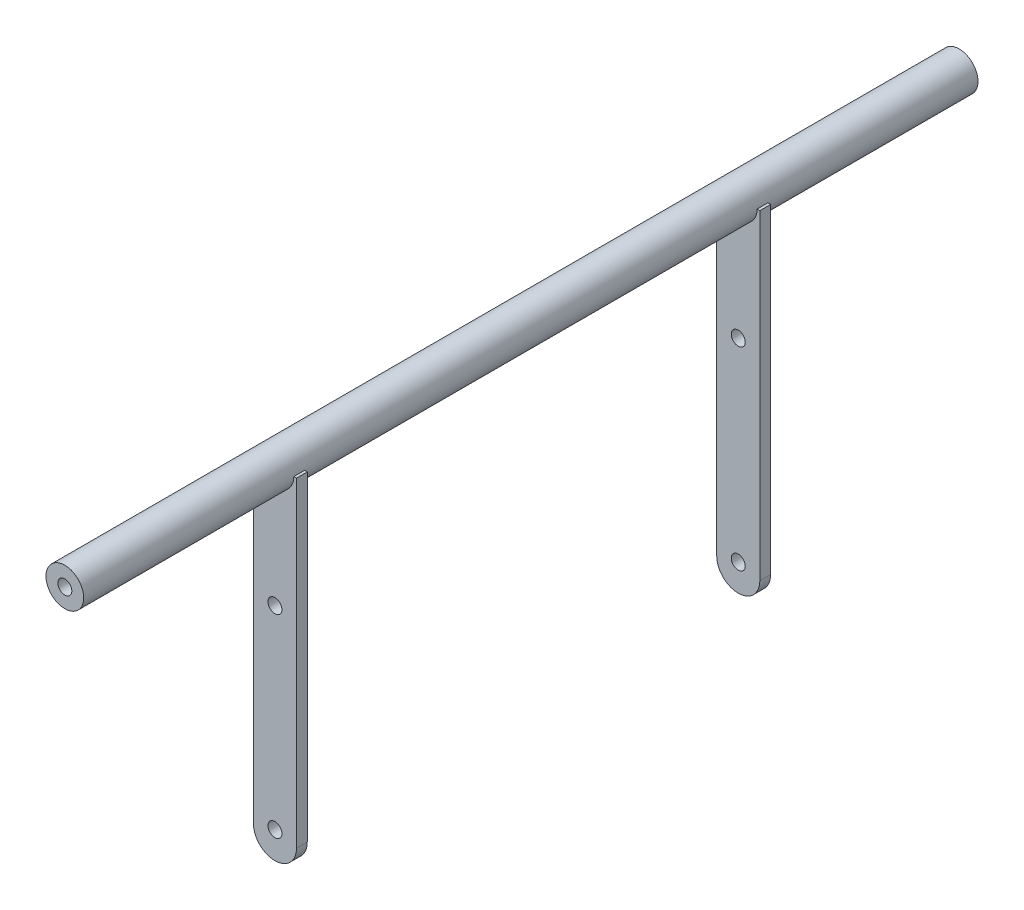
ISO-10303-21;
HEADER;
FILE_DESCRIPTION(('STEP AP214'),'2;1');
FILE_NAME('part.step','',(''),(''),'','','');
FILE_SCHEMA(('AUTOMOTIVE_DESIGN { 1 0 10303 214 1 1 1 1 }'));
ENDSEC;
DATA;
#1=APPLICATION_CONTEXT('core data for automotive mechanical design processes');
#2=APPLICATION_PROTOCOL_DEFINITION('international standard','automotive_design',2000,#1);
#3=PRODUCT_CONTEXT('',#1,'mechanical');
#4=PRODUCT('Part','Part','',(#3));
#5=PRODUCT_RELATED_PRODUCT_CATEGORY('part','',(#4));
#6=PRODUCT_DEFINITION_FORMATION('','',#4);
#7=PRODUCT_DEFINITION_CONTEXT('part definition',#1,'design');
#8=PRODUCT_DEFINITION('design','',#6,#7);
#9=PRODUCT_DEFINITION_SHAPE('','',#8);
#10=(LENGTH_UNIT() NAMED_UNIT(*) SI_UNIT(.MILLI.,.METRE.));
#11=(NAMED_UNIT(*) PLANE_ANGLE_UNIT() SI_UNIT($,.RADIAN.));
#12=(NAMED_UNIT(*) SI_UNIT($,.STERADIAN.) SOLID_ANGLE_UNIT());
#13=UNCERTAINTY_MEASURE_WITH_UNIT(LENGTH_MEASURE(1.E-05),#10,'distance_accuracy_value','');
#14=(GEOMETRIC_REPRESENTATION_CONTEXT(3) GLOBAL_UNCERTAINTY_ASSIGNED_CONTEXT((#13)) GLOBAL_UNIT_ASSIGNED_CONTEXT((#10,
#11,#12)) REPRESENTATION_CONTEXT('',''));
#15=CARTESIAN_POINT('',(0.,0.,0.));
#16=DIRECTION('',(0.,0.,1.));
#17=DIRECTION('',(1.,0.,0.));
#18=AXIS2_PLACEMENT_3D('',#15,#16,#17);
#19=CARTESIAN_POINT('',(0.,0.,415.));
#20=DIRECTION('',(0.,0.,-1.));
#21=DIRECTION('',(-1.,0.,0.));
#22=AXIS2_PLACEMENT_3D('',#19,#20,#21);
#23=CYLINDRICAL_SURFACE('',#22,17.5);
#24=DIRECTION('',(0.,0.,-1.));
#25=VECTOR('',#24,1.);
#26=CARTESIAN_POINT('',(-17.5,0.,415.));
#27=LINE('',#26,#25);
#28=CARTESIAN_POINT('',(-17.5,0.,220.));
#29=VERTEX_POINT('',#28);
#30=CARTESIAN_POINT('',(-17.5,0.,210.));
#31=VERTEX_POINT('',#30);
#32=EDGE_CURVE('E361',#29,#31,#27,.T.);
#33=ORIENTED_EDGE('',*,*,#32,.F.);
#34=CARTESIAN_POINT('',(0.,0.,220.));
#35=DIRECTION('',(0.,0.,-1.));
#36=DIRECTION('',(0.,1.,0.));
#37=AXIS2_PLACEMENT_3D('',#34,#35,#36);
#38=CIRCLE('',#37,17.5);
#39=CARTESIAN_POINT('',(17.5,0.,220.));
#40=VERTEX_POINT('',#39);
#41=EDGE_CURVE('E367',#40,#29,#38,.T.);
#42=ORIENTED_EDGE('',*,*,#41,.F.);
#43=DIRECTION('',(0.,0.,-1.));
#44=VECTOR('',#43,1.);
#45=CARTESIAN_POINT('',(17.5,0.,415.));
#46=LINE('',#45,#44);
#47=CARTESIAN_POINT('',(17.5,0.,210.));
#48=VERTEX_POINT('',#47);
#49=EDGE_CURVE('E357',#48,#40,#46,.F.);
#50=ORIENTED_EDGE('',*,*,#49,.F.);
#51=CARTESIAN_POINT('',(0.,0.,210.));
#52=DIRECTION('',(0.,0.,1.));
#53=DIRECTION('',(0.,-1.,0.));
#54=AXIS2_PLACEMENT_3D('',#51,#52,#53);
#55=CIRCLE('',#54,17.5);
#56=EDGE_CURVE('E364',#31,#48,#55,.T.);
#57=ORIENTED_EDGE('',*,*,#56,.F.);
#58=EDGE_LOOP('',(#33,#42,#50,#57));
#59=FACE_BOUND('',#58,.T.);
#60=CARTESIAN_POINT('',(0.,0.,415.));
#61=DIRECTION('',(0.,0.,1.));
#62=DIRECTION('',(1.,0.,0.));
#63=AXIS2_PLACEMENT_3D('',#60,#61,#62);
#64=CIRCLE('',#63,17.5);
#65=CARTESIAN_POINT('',(17.5,0.,415.));
#66=VERTEX_POINT('',#65);
#67=EDGE_CURVE('E376',#66,#66,#64,.T.);
#68=ORIENTED_EDGE('',*,*,#67,.F.);
#69=EDGE_LOOP('',(#68));
#70=FACE_BOUND('',#69,.T.);
#71=CARTESIAN_POINT('',(0.,0.,-415.));
#72=DIRECTION('',(0.,0.,1.));
#73=DIRECTION('',(1.,0.,0.));
#74=AXIS2_PLACEMENT_3D('',#71,#72,#73);
#75=CIRCLE('',#74,17.5);
#76=CARTESIAN_POINT('',(17.5,0.,-415.));
#77=VERTEX_POINT('',#76);
#78=EDGE_CURVE('E375',#77,#77,#75,.T.);
#79=ORIENTED_EDGE('',*,*,#78,.T.);
#80=EDGE_LOOP('',(#79));
#81=FACE_BOUND('',#80,.T.);
#82=CARTESIAN_POINT('',(0.,0.,-210.));
#83=DIRECTION('',(0.,0.,-1.));
#84=DIRECTION('',(0.,1.,0.));
#85=AXIS2_PLACEMENT_3D('',#82,#83,#84);
#86=CIRCLE('',#85,17.5);
#87=CARTESIAN_POINT('',(17.5,-1.0164568432923E-13,-210.));
#88=VERTEX_POINT('',#87);
#89=CARTESIAN_POINT('',(-17.5,-1.0164568432923E-13,-210.));
#90=VERTEX_POINT('',#89);
#91=EDGE_CURVE('E199',#88,#90,#86,.T.);
#92=ORIENTED_EDGE('',*,*,#91,.F.);
#93=DIRECTION('',(0.,0.,-1.));
#94=VECTOR('',#93,1.);
#95=CARTESIAN_POINT('',(17.5,-1.0164568432923E-13,415.));
#96=LINE('',#95,#94);
#97=CARTESIAN_POINT('',(17.5,0.,-220.));
#98=VERTEX_POINT('',#97);
#99=EDGE_CURVE('E193',#98,#88,#96,.F.);
#100=ORIENTED_EDGE('',*,*,#99,.F.);
#101=CARTESIAN_POINT('',(0.,0.,-220.));
#102=DIRECTION('',(0.,0.,1.));
#103=DIRECTION('',(0.,-1.,0.));
#104=AXIS2_PLACEMENT_3D('',#101,#102,#103);
#105=CIRCLE('',#104,17.5);
#106=CARTESIAN_POINT('',(-17.5,0.,-220.));
#107=VERTEX_POINT('',#106);
#108=EDGE_CURVE('E194',#107,#98,#105,.T.);
#109=ORIENTED_EDGE('',*,*,#108,.F.);
#110=DIRECTION('',(0.,0.,-1.));
#111=VECTOR('',#110,1.);
#112=CARTESIAN_POINT('',(-17.5,-1.0164568432923E-13,415.));
#113=LINE('',#112,#111);
#114=EDGE_CURVE('E338',#90,#107,#113,.T.);
#115=ORIENTED_EDGE('',*,*,#114,.F.);
#116=EDGE_LOOP('',(#92,#100,#109,#115));
#117=FACE_BOUND('',#116,.T.);
#118=ADVANCED_FACE('F45',(#59,#70,#81,#117),#23,.T.);
#119=CARTESIAN_POINT('',(0.,0.,-415.001));
#120=DIRECTION('',(0.,0.,1.));
#121=DIRECTION('',(1.,0.,0.));
#122=AXIS2_PLACEMENT_3D('',#119,#120,#121);
#123=CYLINDRICAL_SURFACE('',#122,6.5);
#124=DIRECTION('',(0.,0.,1.));
#125=VECTOR('',#124,1.);
#126=CARTESIAN_POINT('',(6.5,0.,-415.001));
#127=LINE('',#126,#125);
#128=CARTESIAN_POINT('',(6.5,0.,220.));
#129=VERTEX_POINT('',#128);
#130=CARTESIAN_POINT('',(6.5,0.,210.));
#131=VERTEX_POINT('',#130);
#132=EDGE_CURVE('E390',#129,#131,#127,.F.);
#133=ORIENTED_EDGE('',*,*,#132,.F.);
#134=CARTESIAN_POINT('',(0.,0.,220.));
#135=DIRECTION('',(0.,0.,-1.));
#136=DIRECTION('',(0.,1.,0.));
#137=AXIS2_PLACEMENT_3D('',#134,#135,#136);
#138=CIRCLE('',#137,6.5);
#139=CARTESIAN_POINT('',(-6.5,0.,220.));
#140=VERTEX_POINT('',#139);
#141=EDGE_CURVE('E387',#140,#129,#138,.F.);
#142=ORIENTED_EDGE('',*,*,#141,.F.);
#143=DIRECTION('',(0.,0.,1.));
#144=VECTOR('',#143,1.);
#145=CARTESIAN_POINT('',(-6.5,0.,-415.001));
#146=LINE('',#145,#144);
#147=CARTESIAN_POINT('',(-6.5,0.,210.));
#148=VERTEX_POINT('',#147);
#149=EDGE_CURVE('E379',#148,#140,#146,.T.);
#150=ORIENTED_EDGE('',*,*,#149,.F.);
#151=CARTESIAN_POINT('',(0.,0.,210.));
#152=DIRECTION('',(0.,0.,1.));
#153=DIRECTION('',(0.,-1.,0.));
#154=AXIS2_PLACEMENT_3D('',#151,#152,#153);
#155=CIRCLE('',#154,6.5);
#156=EDGE_CURVE('E384',#131,#148,#155,.F.);
#157=ORIENTED_EDGE('',*,*,#156,.F.);
#158=EDGE_LOOP('',(#133,#142,#150,#157));
#159=FACE_BOUND('',#158,.T.);
#160=CARTESIAN_POINT('',(0.,0.,415.));
#161=DIRECTION('',(0.,0.,1.));
#162=DIRECTION('',(1.,0.,0.));
#163=AXIS2_PLACEMENT_3D('',#160,#161,#162);
#164=CIRCLE('',#163,6.5);
#165=CARTESIAN_POINT('',(6.5,0.,415.));
#166=VERTEX_POINT('',#165);
#167=EDGE_CURVE('E369',#166,#166,#164,.T.);
#168=ORIENTED_EDGE('',*,*,#167,.T.);
#169=EDGE_LOOP('',(#168));
#170=FACE_BOUND('',#169,.T.);
#171=CARTESIAN_POINT('',(0.,0.,-415.));
#172=DIRECTION('',(0.,0.,1.));
#173=DIRECTION('',(1.,0.,0.));
#174=AXIS2_PLACEMENT_3D('',#171,#172,#173);
#175=CIRCLE('',#174,6.5);
#176=CARTESIAN_POINT('',(6.5,0.,-415.));
#177=VERTEX_POINT('',#176);
#178=EDGE_CURVE('E372',#177,#177,#175,.F.);
#179=ORIENTED_EDGE('',*,*,#178,.T.);
#180=EDGE_LOOP('',(#179));
#181=FACE_BOUND('',#180,.T.);
#182=CARTESIAN_POINT('',(0.,0.,-210.));
#183=DIRECTION('',(0.,0.,-1.));
#184=DIRECTION('',(0.,1.,0.));
#185=AXIS2_PLACEMENT_3D('',#182,#183,#184);
#186=CIRCLE('',#185,6.5);
#187=CARTESIAN_POINT('',(-6.5,1.0164592925859E-13,-210.));
#188=VERTEX_POINT('',#187);
#189=CARTESIAN_POINT('',(6.5,1.0164592925859E-13,-210.));
#190=VERTEX_POINT('',#189);
#191=EDGE_CURVE('E402',#188,#190,#186,.F.);
#192=ORIENTED_EDGE('',*,*,#191,.F.);
#193=DIRECTION('',(0.,0.,1.));
#194=VECTOR('',#193,1.);
#195=CARTESIAN_POINT('',(-6.5,1.0164592925859E-13,-415.001));
#196=LINE('',#195,#194);
#197=CARTESIAN_POINT('',(-6.5,0.,-220.));
#198=VERTEX_POINT('',#197);
#199=EDGE_CURVE('E396',#198,#188,#196,.T.);
#200=ORIENTED_EDGE('',*,*,#199,.F.);
#201=CARTESIAN_POINT('',(0.,0.,-220.));
#202=DIRECTION('',(0.,0.,1.));
#203=DIRECTION('',(0.,-1.,0.));
#204=AXIS2_PLACEMENT_3D('',#201,#202,#203);
#205=CIRCLE('',#204,6.5);
#206=CARTESIAN_POINT('',(6.5,0.,-220.));
#207=VERTEX_POINT('',#206);
#208=EDGE_CURVE('E393',#207,#198,#205,.F.);
#209=ORIENTED_EDGE('',*,*,#208,.F.);
#210=DIRECTION('',(0.,0.,1.));
#211=VECTOR('',#210,1.);
#212=CARTESIAN_POINT('',(6.5,1.0164592925859E-13,-415.001));
#213=LINE('',#212,#211);
#214=EDGE_CURVE('E399',#190,#207,#213,.F.);
#215=ORIENTED_EDGE('',*,*,#214,.F.);
#216=EDGE_LOOP('',(#192,#200,#209,#215));
#217=FACE_BOUND('',#216,.T.);
#218=ADVANCED_FACE('F298',(#159,#170,#181,#217),#123,.F.);
#219=CARTESIAN_POINT('',(0.,0.,415.));
#220=DIRECTION('',(0.,0.,1.));
#221=DIRECTION('',(1.,0.,0.));
#222=AXIS2_PLACEMENT_3D('',#219,#220,#221);
#223=PLANE('',#222);
#224=ORIENTED_EDGE('',*,*,#167,.F.);
#225=EDGE_LOOP('',(#224));
#226=FACE_BOUND('',#225,.T.);
#227=ORIENTED_EDGE('',*,*,#67,.T.);
#228=EDGE_LOOP('',(#227));
#229=FACE_BOUND('',#228,.T.);
#230=ADVANCED_FACE('F304',(#226,#229),#223,.T.);
#231=CARTESIAN_POINT('',(0.,0.,-415.));
#232=DIRECTION('',(0.,0.,1.));
#233=DIRECTION('',(1.,0.,0.));
#234=AXIS2_PLACEMENT_3D('',#231,#232,#233);
#235=PLANE('',#234);
#236=ORIENTED_EDGE('',*,*,#178,.F.);
#237=EDGE_LOOP('',(#236));
#238=FACE_BOUND('',#237,.T.);
#239=ORIENTED_EDGE('',*,*,#78,.F.);
#240=EDGE_LOOP('',(#239));
#241=FACE_BOUND('',#240,.T.);
#242=ADVANCED_FACE('F310',(#238,#241),#235,.F.);
#243=CARTESIAN_POINT('',(20.,0.,220.));
#244=DIRECTION('',(0.,-1.,0.));
#245=DIRECTION('',(0.,0.,-1.));
#246=AXIS2_PLACEMENT_3D('',#243,#244,#245);
#247=PLANE('',#246);
#248=DIRECTION('',(-1.,0.,0.));
#249=VECTOR('',#248,1.);
#250=CARTESIAN_POINT('',(20.,0.,220.));
#251=LINE('',#250,#249);
#252=EDGE_CURVE('E353',#129,#140,#251,.T.);
#253=ORIENTED_EDGE('',*,*,#252,.F.);
#254=ORIENTED_EDGE('',*,*,#132,.T.);
#255=DIRECTION('',(-1.,0.,0.));
#256=VECTOR('',#255,1.);
#257=CARTESIAN_POINT('',(20.,0.,210.));
#258=LINE('',#257,#256);
#259=EDGE_CURVE('E358',#131,#148,#258,.T.);
#260=ORIENTED_EDGE('',*,*,#259,.T.);
#261=ORIENTED_EDGE('',*,*,#149,.T.);
#262=EDGE_LOOP('',(#253,#254,#260,#261));
#263=FACE_BOUND('',#262,.T.);
#264=ADVANCED_FACE('F432',(#263),#247,.F.);
#265=CARTESIAN_POINT('',(20.,0.,210.));
#266=DIRECTION('',(0.,0.,1.));
#267=DIRECTION('',(0.,-1.,0.));
#268=AXIS2_PLACEMENT_3D('',#265,#266,#267);
#269=PLANE('',#268);
#270=ORIENTED_EDGE('',*,*,#259,.F.);
#271=ORIENTED_EDGE('',*,*,#156,.T.);
#272=EDGE_LOOP('',(#270,#271));
#273=FACE_BOUND('',#272,.T.);
#274=ADVANCED_FACE('F436',(#273),#269,.F.);
#275=CARTESIAN_POINT('',(20.,0.,220.));
#276=DIRECTION('',(0.,0.,-1.));
#277=DIRECTION('',(0.,1.,0.));
#278=AXIS2_PLACEMENT_3D('',#275,#276,#277);
#279=PLANE('',#278);
#280=ORIENTED_EDGE('',*,*,#252,.T.);
#281=ORIENTED_EDGE('',*,*,#141,.T.);
#282=EDGE_LOOP('',(#280,#281));
#283=FACE_BOUND('',#282,.T.);
#284=ADVANCED_FACE('F438',(#283),#279,.F.);
#285=CARTESIAN_POINT('',(0.,-112.5,220.));
#286=DIRECTION('',(0.,0.,1.));
#287=DIRECTION('',(1.,0.,0.));
#288=AXIS2_PLACEMENT_3D('',#285,#286,#287);
#289=CIRCLE('',#288,6.5);
#290=CARTESIAN_POINT('',(6.50000000000002,-112.5,220.));
#291=VERTEX_POINT('',#290);
#292=EDGE_CURVE('E477',#291,#291,#289,.T.);
#293=ORIENTED_EDGE('',*,*,#292,.F.);
#294=EDGE_LOOP('',(#293));
#295=FACE_BOUND('',#294,.T.);
#296=CARTESIAN_POINT('',(0.,-292.5,220.));
#297=DIRECTION('',(0.,0.,1.));
#298=DIRECTION('',(1.,0.,0.));
#299=AXIS2_PLACEMENT_3D('',#296,#297,#298);
#300=CIRCLE('',#299,6.5);
#301=CARTESIAN_POINT('',(6.5,-292.5,220.));
#302=VERTEX_POINT('',#301);
#303=EDGE_CURVE('E261',#302,#302,#300,.T.);
#304=ORIENTED_EDGE('',*,*,#303,.F.);
#305=EDGE_LOOP('',(#304));
#306=FACE_BOUND('',#305,.T.);
#307=DIRECTION('',(0.,-1.,0.));
#308=VECTOR('',#307,1.);
#309=CARTESIAN_POINT('',(-20.,0.,220.));
#310=LINE('',#309,#308);
#311=CARTESIAN_POINT('',(-20.,0.,220.));
#312=VERTEX_POINT('',#311);
#313=CARTESIAN_POINT('',(-20.,-297.5,220.));
#314=VERTEX_POINT('',#313);
#315=EDGE_CURVE('E331',#312,#314,#310,.T.);
#316=ORIENTED_EDGE('',*,*,#315,.T.);
#317=CARTESIAN_POINT('',(0.,-297.5,220.));
#318=DIRECTION('',(0.,0.,-1.));
#319=DIRECTION('',(0.,1.,0.));
#320=AXIS2_PLACEMENT_3D('',#317,#318,#319);
#321=CIRCLE('',#320,20.);
#322=CARTESIAN_POINT('',(0.,-317.5,220.));
#323=VERTEX_POINT('',#322);
#324=EDGE_CURVE('E54',#314,#323,#321,.F.);
#325=ORIENTED_EDGE('',*,*,#324,.T.);
#326=CARTESIAN_POINT('',(0.,-297.5,220.));
#327=DIRECTION('',(0.,0.,-1.));
#328=DIRECTION('',(0.,1.,0.));
#329=AXIS2_PLACEMENT_3D('',#326,#327,#328);
#330=CIRCLE('',#329,20.);
#331=CARTESIAN_POINT('',(20.,-297.5,220.));
#332=VERTEX_POINT('',#331);
#333=EDGE_CURVE('E62',#323,#332,#330,.F.);
#334=ORIENTED_EDGE('',*,*,#333,.T.);
#335=DIRECTION('',(0.,-1.,0.));
#336=VECTOR('',#335,1.);
#337=CARTESIAN_POINT('',(20.,0.,220.));
#338=LINE('',#337,#336);
#339=CARTESIAN_POINT('',(20.,0.,220.));
#340=VERTEX_POINT('',#339);
#341=EDGE_CURVE('E348',#340,#332,#338,.T.);
#342=ORIENTED_EDGE('',*,*,#341,.F.);
#343=EDGE_CURVE('E349',#340,#40,#251,.T.);
#344=ORIENTED_EDGE('',*,*,#343,.T.);
#345=ORIENTED_EDGE('',*,*,#41,.T.);
#346=EDGE_CURVE('E336',#29,#312,#251,.T.);
#347=ORIENTED_EDGE('',*,*,#346,.T.);
#348=EDGE_LOOP('',(#316,#325,#334,#342,#344,#345,#347));
#349=FACE_BOUND('',#348,.T.);
#350=ADVANCED_FACE('F333',(#295,#306,#349),#279,.F.);
#351=CARTESIAN_POINT('',(0.,-112.5,210.));
#352=DIRECTION('',(0.,0.,1.));
#353=DIRECTION('',(0.,-1.,0.));
#354=AXIS2_PLACEMENT_3D('',#351,#352,#353);
#355=CIRCLE('',#354,6.5);
#356=CARTESIAN_POINT('',(0.,-119.,210.));
#357=VERTEX_POINT('',#356);
#358=EDGE_CURVE('E267',#357,#357,#355,.T.);
#359=ORIENTED_EDGE('',*,*,#358,.T.);
#360=EDGE_LOOP('',(#359));
#361=FACE_BOUND('',#360,.T.);
#362=CARTESIAN_POINT('',(0.,-292.5,210.));
#363=DIRECTION('',(0.,0.,1.));
#364=DIRECTION('',(0.,-1.,0.));
#365=AXIS2_PLACEMENT_3D('',#362,#363,#364);
#366=CIRCLE('',#365,6.5);
#367=CARTESIAN_POINT('',(0.,-299.,210.));
#368=VERTEX_POINT('',#367);
#369=EDGE_CURVE('E257',#368,#368,#366,.T.);
#370=ORIENTED_EDGE('',*,*,#369,.T.);
#371=EDGE_LOOP('',(#370));
#372=FACE_BOUND('',#371,.T.);
#373=CARTESIAN_POINT('',(0.,-297.5,210.));
#374=DIRECTION('',(0.,0.,1.));
#375=DIRECTION('',(0.,-1.,0.));
#376=AXIS2_PLACEMENT_3D('',#373,#374,#375);
#377=CIRCLE('',#376,20.);
#378=CARTESIAN_POINT('',(20.,-297.5,210.));
#379=VERTEX_POINT('',#378);
#380=CARTESIAN_POINT('',(0.,-317.5,210.));
#381=VERTEX_POINT('',#380);
#382=EDGE_CURVE('E245',#379,#381,#377,.F.);
#383=ORIENTED_EDGE('',*,*,#382,.T.);
#384=CARTESIAN_POINT('',(0.,-297.5,210.));
#385=DIRECTION('',(0.,0.,1.));
#386=DIRECTION('',(0.,-1.,0.));
#387=AXIS2_PLACEMENT_3D('',#384,#385,#386);
#388=CIRCLE('',#387,20.);
#389=CARTESIAN_POINT('',(-20.,-297.5,210.));
#390=VERTEX_POINT('',#389);
#391=EDGE_CURVE('E247',#381,#390,#388,.F.);
#392=ORIENTED_EDGE('',*,*,#391,.T.);
#393=DIRECTION('',(0.,1.,0.));
#394=VECTOR('',#393,1.);
#395=CARTESIAN_POINT('',(-20.,0.,210.));
#396=LINE('',#395,#394);
#397=CARTESIAN_POINT('',(-20.,0.,210.));
#398=VERTEX_POINT('',#397);
#399=EDGE_CURVE('E332',#390,#398,#396,.T.);
#400=ORIENTED_EDGE('',*,*,#399,.T.);
#401=EDGE_CURVE('E352',#31,#398,#258,.T.);
#402=ORIENTED_EDGE('',*,*,#401,.F.);
#403=ORIENTED_EDGE('',*,*,#56,.T.);
#404=CARTESIAN_POINT('',(20.,0.,210.));
#405=VERTEX_POINT('',#404);
#406=EDGE_CURVE('E354',#405,#48,#258,.T.);
#407=ORIENTED_EDGE('',*,*,#406,.F.);
#408=DIRECTION('',(0.,1.,0.));
#409=VECTOR('',#408,1.);
#410=CARTESIAN_POINT('',(20.,0.,210.));
#411=LINE('',#410,#409);
#412=EDGE_CURVE('E665',#379,#405,#411,.T.);
#413=ORIENTED_EDGE('',*,*,#412,.F.);
#414=EDGE_LOOP('',(#383,#392,#400,#402,#403,#407,#413));
#415=FACE_BOUND('',#414,.T.);
#416=ADVANCED_FACE('F279',(#361,#372,#415),#269,.F.);
#417=ORIENTED_EDGE('',*,*,#346,.F.);
#418=ORIENTED_EDGE('',*,*,#32,.T.);
#419=ORIENTED_EDGE('',*,*,#401,.T.);
#420=DIRECTION('',(0.,0.,1.));
#421=VECTOR('',#420,1.);
#422=CARTESIAN_POINT('',(-20.,0.,220.));
#423=LINE('',#422,#421);
#424=EDGE_CURVE('E340',#398,#312,#423,.T.);
#425=ORIENTED_EDGE('',*,*,#424,.T.);
#426=EDGE_LOOP('',(#417,#418,#419,#425));
#427=FACE_BOUND('',#426,.T.);
#428=ADVANCED_FACE('F428',(#427),#247,.F.);
#429=ORIENTED_EDGE('',*,*,#406,.T.);
#430=ORIENTED_EDGE('',*,*,#49,.T.);
#431=ORIENTED_EDGE('',*,*,#343,.F.);
#432=DIRECTION('',(0.,0.,1.));
#433=VECTOR('',#432,1.);
#434=CARTESIAN_POINT('',(20.,0.,220.));
#435=LINE('',#434,#433);
#436=EDGE_CURVE('E344',#405,#340,#435,.T.);
#437=ORIENTED_EDGE('',*,*,#436,.F.);
#438=EDGE_LOOP('',(#429,#430,#431,#437));
#439=FACE_BOUND('',#438,.T.);
#440=ADVANCED_FACE('F423',(#439),#247,.F.);
#441=CARTESIAN_POINT('',(20.,0.,0.));
#442=DIRECTION('',(1.,0.,0.));
#443=DIRECTION('',(0.,0.,-1.));
#444=AXIS2_PLACEMENT_3D('',#441,#442,#443);
#445=PLANE('',#444);
#446=ORIENTED_EDGE('',*,*,#341,.T.);
#447=DIRECTION('',(0.,0.,-1.));
#448=VECTOR('',#447,1.);
#449=CARTESIAN_POINT('',(20.,-297.5,210.));
#450=LINE('',#449,#448);
#451=EDGE_CURVE('E13',#332,#379,#450,.T.);
#452=ORIENTED_EDGE('',*,*,#451,.T.);
#453=ORIENTED_EDGE('',*,*,#412,.T.);
#454=ORIENTED_EDGE('',*,*,#436,.T.);
#455=EDGE_LOOP('',(#446,#452,#453,#454));
#456=FACE_BOUND('',#455,.T.);
#457=ADVANCED_FACE('F420',(#456),#445,.T.);
#458=CARTESIAN_POINT('',(-20.,0.,0.));
#459=DIRECTION('',(1.,0.,0.));
#460=DIRECTION('',(0.,0.,-1.));
#461=AXIS2_PLACEMENT_3D('',#458,#459,#460);
#462=PLANE('',#461);
#463=ORIENTED_EDGE('',*,*,#399,.F.);
#464=DIRECTION('',(0.,0.,-1.));
#465=VECTOR('',#464,1.);
#466=CARTESIAN_POINT('',(-20.,-297.5,0.));
#467=LINE('',#466,#465);
#468=EDGE_CURVE('E249',#390,#314,#467,.F.);
#469=ORIENTED_EDGE('',*,*,#468,.T.);
#470=ORIENTED_EDGE('',*,*,#315,.F.);
#471=ORIENTED_EDGE('',*,*,#424,.F.);
#472=EDGE_LOOP('',(#463,#469,#470,#471));
#473=FACE_BOUND('',#472,.T.);
#474=ADVANCED_FACE('F329',(#473),#462,.F.);
#475=CARTESIAN_POINT('',(20.,0.,-220.));
#476=DIRECTION('',(0.,0.,1.));
#477=DIRECTION('',(0.,-1.,0.));
#478=AXIS2_PLACEMENT_3D('',#475,#476,#477);
#479=PLANE('',#478);
#480=DIRECTION('',(-1.,0.,0.));
#481=VECTOR('',#480,1.);
#482=CARTESIAN_POINT('',(20.,0.,-220.));
#483=LINE('',#482,#481);
#484=EDGE_CURVE('E206',#207,#198,#483,.T.);
#485=ORIENTED_EDGE('',*,*,#484,.F.);
#486=ORIENTED_EDGE('',*,*,#208,.T.);
#487=EDGE_LOOP('',(#485,#486));
#488=FACE_BOUND('',#487,.T.);
#489=ADVANCED_FACE('F427',(#488),#479,.F.);
#490=CARTESIAN_POINT('',(20.,0.,-210.));
#491=DIRECTION('',(0.,0.,-1.));
#492=DIRECTION('',(0.,1.,0.));
#493=AXIS2_PLACEMENT_3D('',#490,#491,#492);
#494=PLANE('',#493);
#495=DIRECTION('',(-1.,0.,0.));
#496=VECTOR('',#495,1.);
#497=CARTESIAN_POINT('',(20.,0.,-210.));
#498=LINE('',#497,#496);
#499=EDGE_CURVE('E195',#190,#188,#498,.T.);
#500=ORIENTED_EDGE('',*,*,#499,.T.);
#501=ORIENTED_EDGE('',*,*,#191,.T.);
#502=EDGE_LOOP('',(#500,#501));
#503=FACE_BOUND('',#502,.T.);
#504=ADVANCED_FACE('F415',(#503),#494,.F.);
#505=CARTESIAN_POINT('',(20.,0.,-220.));
#506=DIRECTION('',(0.,-1.,0.));
#507=DIRECTION('',(0.,0.,-1.));
#508=AXIS2_PLACEMENT_3D('',#505,#506,#507);
#509=PLANE('',#508);
#510=ORIENTED_EDGE('',*,*,#499,.F.);
#511=ORIENTED_EDGE('',*,*,#214,.T.);
#512=ORIENTED_EDGE('',*,*,#484,.T.);
#513=ORIENTED_EDGE('',*,*,#199,.T.);
#514=EDGE_LOOP('',(#510,#511,#512,#513));
#515=FACE_BOUND('',#514,.T.);
#516=ADVANCED_FACE('F409',(#515),#509,.F.);
#517=CARTESIAN_POINT('',(-20.,0.,-210.));
#518=VERTEX_POINT('',#517);
#519=EDGE_CURVE('E197',#90,#518,#498,.T.);
#520=ORIENTED_EDGE('',*,*,#519,.F.);
#521=ORIENTED_EDGE('',*,*,#114,.T.);
#522=CARTESIAN_POINT('',(-20.,0.,-220.));
#523=VERTEX_POINT('',#522);
#524=EDGE_CURVE('E207',#107,#523,#483,.T.);
#525=ORIENTED_EDGE('',*,*,#524,.T.);
#526=DIRECTION('',(0.,0.,1.));
#527=VECTOR('',#526,1.);
#528=CARTESIAN_POINT('',(-20.,0.,-220.));
#529=LINE('',#528,#527);
#530=EDGE_CURVE('E218',#523,#518,#529,.T.);
#531=ORIENTED_EDGE('',*,*,#530,.T.);
#532=EDGE_LOOP('',(#520,#521,#525,#531));
#533=FACE_BOUND('',#532,.T.);
#534=ADVANCED_FACE('F407',(#533),#509,.F.);
#535=CARTESIAN_POINT('',(20.,0.,-220.));
#536=VERTEX_POINT('',#535);
#537=EDGE_CURVE('E203',#536,#98,#483,.T.);
#538=ORIENTED_EDGE('',*,*,#537,.T.);
#539=ORIENTED_EDGE('',*,*,#99,.T.);
#540=CARTESIAN_POINT('',(20.,0.,-210.));
#541=VERTEX_POINT('',#540);
#542=EDGE_CURVE('E175',#541,#88,#498,.T.);
#543=ORIENTED_EDGE('',*,*,#542,.F.);
#544=DIRECTION('',(0.,0.,1.));
#545=VECTOR('',#544,1.);
#546=CARTESIAN_POINT('',(20.,0.,-220.));
#547=LINE('',#546,#545);
#548=EDGE_CURVE('E181',#536,#541,#547,.T.);
#549=ORIENTED_EDGE('',*,*,#548,.F.);
#550=EDGE_LOOP('',(#538,#539,#543,#549));
#551=FACE_BOUND('',#550,.T.);
#552=ADVANCED_FACE('F192',(#551),#509,.F.);
#553=CARTESIAN_POINT('',(0.,-112.5,-210.));
#554=DIRECTION('',(0.,0.,-1.));
#555=DIRECTION('',(0.,1.,0.));
#556=AXIS2_PLACEMENT_3D('',#553,#554,#555);
#557=CIRCLE('',#556,6.5);
#558=CARTESIAN_POINT('',(0.,-106.,-210.));
#559=VERTEX_POINT('',#558);
#560=EDGE_CURVE('E272',#559,#559,#557,.T.);
#561=ORIENTED_EDGE('',*,*,#560,.T.);
#562=EDGE_LOOP('',(#561));
#563=FACE_BOUND('',#562,.T.);
#564=CARTESIAN_POINT('',(0.,-292.5,-210.));
#565=DIRECTION('',(0.,0.,-1.));
#566=DIRECTION('',(0.,1.,0.));
#567=AXIS2_PLACEMENT_3D('',#564,#565,#566);
#568=CIRCLE('',#567,6.5);
#569=CARTESIAN_POINT('',(0.,-286.,-210.));
#570=VERTEX_POINT('',#569);
#571=EDGE_CURVE('E260',#570,#570,#568,.T.);
#572=ORIENTED_EDGE('',*,*,#571,.T.);
#573=EDGE_LOOP('',(#572));
#574=FACE_BOUND('',#573,.T.);
#575=DIRECTION('',(0.,-1.,0.));
#576=VECTOR('',#575,1.);
#577=CARTESIAN_POINT('',(-20.,0.,-210.));
#578=LINE('',#577,#576);
#579=CARTESIAN_POINT('',(-20.,-297.5,-210.));
#580=VERTEX_POINT('',#579);
#581=EDGE_CURVE('E220',#518,#580,#578,.T.);
#582=ORIENTED_EDGE('',*,*,#581,.T.);
#583=CARTESIAN_POINT('',(0.,-297.5,-210.));
#584=DIRECTION('',(0.,0.,-1.));
#585=DIRECTION('',(0.,1.,0.));
#586=AXIS2_PLACEMENT_3D('',#583,#584,#585);
#587=CIRCLE('',#586,20.);
#588=CARTESIAN_POINT('',(0.,-317.5,-210.));
#589=VERTEX_POINT('',#588);
#590=EDGE_CURVE('E235',#580,#589,#587,.F.);
#591=ORIENTED_EDGE('',*,*,#590,.T.);
#592=CARTESIAN_POINT('',(0.,-297.5,-210.));
#593=DIRECTION('',(0.,0.,-1.));
#594=DIRECTION('',(0.,1.,0.));
#595=AXIS2_PLACEMENT_3D('',#592,#593,#594);
#596=CIRCLE('',#595,20.);
#597=CARTESIAN_POINT('',(20.,-297.5,-210.));
#598=VERTEX_POINT('',#597);
#599=EDGE_CURVE('E177',#589,#598,#596,.F.);
#600=ORIENTED_EDGE('',*,*,#599,.T.);
#601=DIRECTION('',(0.,-1.,0.));
#602=VECTOR('',#601,1.);
#603=CARTESIAN_POINT('',(20.,0.,-210.));
#604=LINE('',#603,#602);
#605=EDGE_CURVE('E169',#541,#598,#604,.T.);
#606=ORIENTED_EDGE('',*,*,#605,.F.);
#607=ORIENTED_EDGE('',*,*,#542,.T.);
#608=ORIENTED_EDGE('',*,*,#91,.T.);
#609=ORIENTED_EDGE('',*,*,#519,.T.);
#610=EDGE_LOOP('',(#582,#591,#600,#606,#607,#608,#609));
#611=FACE_BOUND('',#610,.T.);
#612=ADVANCED_FACE('F172',(#563,#574,#611),#494,.F.);
#613=CARTESIAN_POINT('',(0.,-112.5,-220.));
#614=DIRECTION('',(0.,0.,1.));
#615=DIRECTION('',(0.,-1.,0.));
#616=AXIS2_PLACEMENT_3D('',#613,#614,#615);
#617=CIRCLE('',#616,6.5);
#618=CARTESIAN_POINT('',(0.,-119.,-220.));
#619=VERTEX_POINT('',#618);
#620=EDGE_CURVE('E49',#619,#619,#617,.T.);
#621=ORIENTED_EDGE('',*,*,#620,.T.);
#622=EDGE_LOOP('',(#621));
#623=FACE_BOUND('',#622,.T.);
#624=CARTESIAN_POINT('',(0.,-292.5,-220.));
#625=DIRECTION('',(0.,0.,1.));
#626=DIRECTION('',(0.,-1.,0.));
#627=AXIS2_PLACEMENT_3D('',#624,#625,#626);
#628=CIRCLE('',#627,6.5);
#629=CARTESIAN_POINT('',(0.,-299.,-220.));
#630=VERTEX_POINT('',#629);
#631=EDGE_CURVE('E258',#630,#630,#628,.T.);
#632=ORIENTED_EDGE('',*,*,#631,.T.);
#633=EDGE_LOOP('',(#632));
#634=FACE_BOUND('',#633,.T.);
#635=CARTESIAN_POINT('',(0.,-297.5,-220.));
#636=DIRECTION('',(0.,0.,1.));
#637=DIRECTION('',(0.,-1.,0.));
#638=AXIS2_PLACEMENT_3D('',#635,#636,#637);
#639=CIRCLE('',#638,20.);
#640=CARTESIAN_POINT('',(20.,-297.5,-220.));
#641=VERTEX_POINT('',#640);
#642=CARTESIAN_POINT('',(0.,-317.5,-220.));
#643=VERTEX_POINT('',#642);
#644=EDGE_CURVE('E238',#641,#643,#639,.F.);
#645=ORIENTED_EDGE('',*,*,#644,.T.);
#646=CARTESIAN_POINT('',(0.,-297.5,-220.));
#647=DIRECTION('',(0.,0.,1.));
#648=DIRECTION('',(0.,-1.,0.));
#649=AXIS2_PLACEMENT_3D('',#646,#647,#648);
#650=CIRCLE('',#649,20.);
#651=CARTESIAN_POINT('',(-20.,-297.5,-220.));
#652=VERTEX_POINT('',#651);
#653=EDGE_CURVE('E226',#643,#652,#650,.F.);
#654=ORIENTED_EDGE('',*,*,#653,.T.);
#655=DIRECTION('',(0.,1.,0.));
#656=VECTOR('',#655,1.);
#657=CARTESIAN_POINT('',(-20.,0.,-220.));
#658=LINE('',#657,#656);
#659=EDGE_CURVE('E189',#652,#523,#658,.T.);
#660=ORIENTED_EDGE('',*,*,#659,.T.);
#661=ORIENTED_EDGE('',*,*,#524,.F.);
#662=ORIENTED_EDGE('',*,*,#108,.T.);
#663=ORIENTED_EDGE('',*,*,#537,.F.);
#664=DIRECTION('',(0.,1.,0.));
#665=VECTOR('',#664,1.);
#666=CARTESIAN_POINT('',(20.,0.,-220.));
#667=LINE('',#666,#665);
#668=EDGE_CURVE('E180',#641,#536,#667,.T.);
#669=ORIENTED_EDGE('',*,*,#668,.F.);
#670=EDGE_LOOP('',(#645,#654,#660,#661,#662,#663,#669));
#671=FACE_BOUND('',#670,.T.);
#672=ADVANCED_FACE('F224',(#623,#634,#671),#479,.F.);
#673=CARTESIAN_POINT('',(20.,0.,0.));
#674=DIRECTION('',(1.,0.,0.));
#675=DIRECTION('',(0.,0.,-1.));
#676=AXIS2_PLACEMENT_3D('',#673,#674,#675);
#677=PLANE('',#676);
#678=ORIENTED_EDGE('',*,*,#605,.T.);
#679=DIRECTION('',(0.,0.,-1.));
#680=VECTOR('',#679,1.);
#681=CARTESIAN_POINT('',(20.,-297.5,-220.));
#682=LINE('',#681,#680);
#683=EDGE_CURVE('E243',#598,#641,#682,.T.);
#684=ORIENTED_EDGE('',*,*,#683,.T.);
#685=ORIENTED_EDGE('',*,*,#668,.T.);
#686=ORIENTED_EDGE('',*,*,#548,.T.);
#687=EDGE_LOOP('',(#678,#684,#685,#686));
#688=FACE_BOUND('',#687,.T.);
#689=ADVANCED_FACE('F184',(#688),#677,.T.);
#690=CARTESIAN_POINT('',(-20.,0.,0.));
#691=DIRECTION('',(1.,0.,0.));
#692=DIRECTION('',(0.,0.,-1.));
#693=AXIS2_PLACEMENT_3D('',#690,#691,#692);
#694=PLANE('',#693);
#695=ORIENTED_EDGE('',*,*,#659,.F.);
#696=DIRECTION('',(0.,0.,-1.));
#697=VECTOR('',#696,1.);
#698=CARTESIAN_POINT('',(-20.,-297.5,0.));
#699=LINE('',#698,#697);
#700=EDGE_CURVE('E231',#652,#580,#699,.F.);
#701=ORIENTED_EDGE('',*,*,#700,.T.);
#702=ORIENTED_EDGE('',*,*,#581,.F.);
#703=ORIENTED_EDGE('',*,*,#530,.F.);
#704=EDGE_LOOP('',(#695,#701,#702,#703));
#705=FACE_BOUND('',#704,.T.);
#706=ADVANCED_FACE('F230',(#705),#694,.F.);
#707=CARTESIAN_POINT('',(0.,-297.5,0.));
#708=DIRECTION('',(0.,0.,1.));
#709=DIRECTION('',(1.,0.,0.));
#710=AXIS2_PLACEMENT_3D('',#707,#708,#709);
#711=CYLINDRICAL_SURFACE('',#710,20.);
#712=ORIENTED_EDGE('',*,*,#683,.F.);
#713=ORIENTED_EDGE('',*,*,#599,.F.);
#714=DIRECTION('',(0.,0.,-1.));
#715=VECTOR('',#714,1.);
#716=CARTESIAN_POINT('',(0.,-317.5,-210.));
#717=LINE('',#716,#715);
#718=EDGE_CURVE('E221',#643,#589,#717,.F.);
#719=ORIENTED_EDGE('',*,*,#718,.F.);
#720=ORIENTED_EDGE('',*,*,#644,.F.);
#721=EDGE_LOOP('',(#712,#713,#719,#720));
#722=FACE_BOUND('',#721,.T.);
#723=ADVANCED_FACE('F314',(#722),#711,.T.);
#724=CARTESIAN_POINT('',(0.,-297.5,-220.));
#725=DIRECTION('',(0.,0.,-1.));
#726=DIRECTION('',(-1.,0.,0.));
#727=AXIS2_PLACEMENT_3D('',#724,#725,#726);
#728=CYLINDRICAL_SURFACE('',#727,20.);
#729=ORIENTED_EDGE('',*,*,#590,.F.);
#730=ORIENTED_EDGE('',*,*,#700,.F.);
#731=ORIENTED_EDGE('',*,*,#653,.F.);
#732=ORIENTED_EDGE('',*,*,#718,.T.);
#733=EDGE_LOOP('',(#729,#730,#731,#732));
#734=FACE_BOUND('',#733,.T.);
#735=ADVANCED_FACE('F233',(#734),#728,.T.);
#736=CARTESIAN_POINT('',(0.,-297.5,0.));
#737=DIRECTION('',(0.,0.,1.));
#738=DIRECTION('',(1.,0.,0.));
#739=AXIS2_PLACEMENT_3D('',#736,#737,#738);
#740=CYLINDRICAL_SURFACE('',#739,20.);
#741=ORIENTED_EDGE('',*,*,#451,.F.);
#742=ORIENTED_EDGE('',*,*,#333,.F.);
#743=DIRECTION('',(0.,0.,-1.));
#744=VECTOR('',#743,1.);
#745=CARTESIAN_POINT('',(0.,-317.5,220.));
#746=LINE('',#745,#744);
#747=EDGE_CURVE('E255',#381,#323,#746,.F.);
#748=ORIENTED_EDGE('',*,*,#747,.F.);
#749=ORIENTED_EDGE('',*,*,#382,.F.);
#750=EDGE_LOOP('',(#741,#742,#748,#749));
#751=FACE_BOUND('',#750,.T.);
#752=ADVANCED_FACE('F47',(#751),#740,.T.);
#753=CARTESIAN_POINT('',(0.,-297.5,220.));
#754=DIRECTION('',(0.,0.,-1.));
#755=DIRECTION('',(-1.,0.,0.));
#756=AXIS2_PLACEMENT_3D('',#753,#754,#755);
#757=CYLINDRICAL_SURFACE('',#756,20.);
#758=ORIENTED_EDGE('',*,*,#324,.F.);
#759=ORIENTED_EDGE('',*,*,#468,.F.);
#760=ORIENTED_EDGE('',*,*,#391,.F.);
#761=ORIENTED_EDGE('',*,*,#747,.T.);
#762=EDGE_LOOP('',(#758,#759,#760,#761));
#763=FACE_BOUND('',#762,.T.);
#764=ADVANCED_FACE('F294',(#763),#757,.T.);
#765=CARTESIAN_POINT('',(0.,-292.5,-322.));
#766=DIRECTION('',(0.,0.,1.));
#767=DIRECTION('',(1.,0.,0.));
#768=AXIS2_PLACEMENT_3D('',#765,#766,#767);
#769=CYLINDRICAL_SURFACE('',#768,6.5);
#770=ORIENTED_EDGE('',*,*,#631,.F.);
#771=EDGE_LOOP('',(#770));
#772=FACE_BOUND('',#771,.T.);
#773=ORIENTED_EDGE('',*,*,#571,.F.);
#774=EDGE_LOOP('',(#773));
#775=FACE_BOUND('',#774,.T.);
#776=ADVANCED_FACE('F285',(#772,#775),#769,.F.);
#777=ORIENTED_EDGE('',*,*,#303,.T.);
#778=EDGE_LOOP('',(#777));
#779=FACE_BOUND('',#778,.T.);
#780=ORIENTED_EDGE('',*,*,#369,.F.);
#781=EDGE_LOOP('',(#780));
#782=FACE_BOUND('',#781,.T.);
#783=ADVANCED_FACE('F282',(#779,#782),#769,.F.);
#784=CARTESIAN_POINT('',(0.,-112.5,-322.));
#785=DIRECTION('',(0.,0.,1.));
#786=DIRECTION('',(1.,0.,0.));
#787=AXIS2_PLACEMENT_3D('',#784,#785,#786);
#788=CYLINDRICAL_SURFACE('',#787,6.5);
#789=ORIENTED_EDGE('',*,*,#620,.F.);
#790=EDGE_LOOP('',(#789));
#791=FACE_BOUND('',#790,.T.);
#792=ORIENTED_EDGE('',*,*,#560,.F.);
#793=EDGE_LOOP('',(#792));
#794=FACE_BOUND('',#793,.T.);
#795=ADVANCED_FACE('F284',(#791,#794),#788,.F.);
#796=ORIENTED_EDGE('',*,*,#292,.T.);
#797=EDGE_LOOP('',(#796));
#798=FACE_BOUND('',#797,.T.);
#799=ORIENTED_EDGE('',*,*,#358,.F.);
#800=EDGE_LOOP('',(#799));
#801=FACE_BOUND('',#800,.T.);
#802=ADVANCED_FACE('F291',(#798,#801),#788,.F.);
#803=CLOSED_SHELL('',(#118,#218,#230,#242,#264,#274,#284,#350,#416,#428,#440,#457,#474,#489,
#504,#516,#534,#552,#612,#672,#689,#706,#723,#735,#752,#764,#776,#783,#795,#802));
#804=MANIFOLD_SOLID_BREP('B2',#803);
#805=ADVANCED_BREP_SHAPE_REPRESENTATION('',(#18,#804),#14);
#806=SHAPE_DEFINITION_REPRESENTATION(#9,#805);
ENDSEC;
END-ISO-10303-21;
